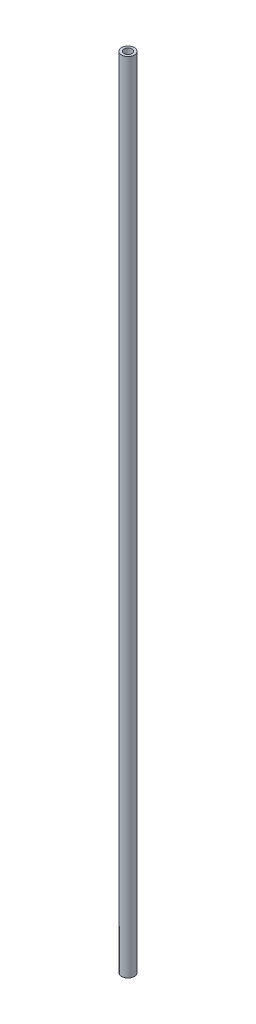
ISO-10303-21;
HEADER;
FILE_DESCRIPTION(('STEP AP214'),'2;1');
FILE_NAME('part.step','',(''),(''),'','','');
FILE_SCHEMA(('AUTOMOTIVE_DESIGN { 1 0 10303 214 1 1 1 1 }'));
ENDSEC;
DATA;
#1=APPLICATION_CONTEXT('core data for automotive mechanical design processes');
#2=APPLICATION_PROTOCOL_DEFINITION('international standard','automotive_design',2000,#1);
#3=PRODUCT_CONTEXT('',#1,'mechanical');
#4=PRODUCT('Part','Part','',(#3));
#5=PRODUCT_RELATED_PRODUCT_CATEGORY('part','',(#4));
#6=PRODUCT_DEFINITION_FORMATION('','',#4);
#7=PRODUCT_DEFINITION_CONTEXT('part definition',#1,'design');
#8=PRODUCT_DEFINITION('design','',#6,#7);
#9=PRODUCT_DEFINITION_SHAPE('','',#8);
#10=(LENGTH_UNIT() NAMED_UNIT(*) SI_UNIT(.MILLI.,.METRE.));
#11=(NAMED_UNIT(*) PLANE_ANGLE_UNIT() SI_UNIT($,.RADIAN.));
#12=(NAMED_UNIT(*) SI_UNIT($,.STERADIAN.) SOLID_ANGLE_UNIT());
#13=UNCERTAINTY_MEASURE_WITH_UNIT(LENGTH_MEASURE(1.E-05),#10,'distance_accuracy_value','');
#14=(GEOMETRIC_REPRESENTATION_CONTEXT(3) GLOBAL_UNCERTAINTY_ASSIGNED_CONTEXT((#13)) GLOBAL_UNIT_ASSIGNED_CONTEXT((#10,
#11,#12)) REPRESENTATION_CONTEXT('',''));
#15=CARTESIAN_POINT('',(0.,0.,0.));
#16=DIRECTION('',(0.,0.,1.));
#17=DIRECTION('',(1.,0.,0.));
#18=AXIS2_PLACEMENT_3D('',#15,#16,#17);
#19=CARTESIAN_POINT('',(0.,495.,0.));
#20=DIRECTION('',(0.,1.,0.));
#21=DIRECTION('',(0.,0.,1.));
#22=AXIS2_PLACEMENT_3D('',#19,#20,#21);
#23=PLANE('',#22);
#24=CARTESIAN_POINT('',(0.,495.,0.));
#25=DIRECTION('',(0.,1.,0.));
#26=DIRECTION('',(0.,0.,1.));
#27=AXIS2_PLACEMENT_3D('',#24,#25,#26);
#28=CIRCLE('',#27,4.);
#29=CARTESIAN_POINT('',(0.,495.,4.));
#30=VERTEX_POINT('',#29);
#31=EDGE_CURVE('E10',#30,#30,#28,.T.);
#32=ORIENTED_EDGE('',*,*,#31,.T.);
#33=EDGE_LOOP('',(#32));
#34=FACE_BOUND('',#33,.T.);
#35=CARTESIAN_POINT('',(0.,495.,0.));
#36=DIRECTION('',(0.,1.,0.));
#37=DIRECTION('',(0.,0.,1.));
#38=AXIS2_PLACEMENT_3D('',#35,#36,#37);
#39=CIRCLE('',#38,2.5);
#40=CARTESIAN_POINT('',(0.,495.,2.5));
#41=VERTEX_POINT('',#40);
#42=EDGE_CURVE('E44',#41,#41,#39,.T.);
#43=ORIENTED_EDGE('',*,*,#42,.F.);
#44=EDGE_LOOP('',(#43));
#45=FACE_BOUND('',#44,.T.);
#46=ADVANCED_FACE('F33',(#34,#45),#23,.T.);
#47=CARTESIAN_POINT('',(0.,0.,0.));
#48=DIRECTION('',(0.,1.,0.));
#49=DIRECTION('',(0.,0.,1.));
#50=AXIS2_PLACEMENT_3D('',#47,#48,#49);
#51=PLANE('',#50);
#52=CARTESIAN_POINT('',(0.,0.,0.));
#53=DIRECTION('',(0.,1.,0.));
#54=DIRECTION('',(0.,0.,1.));
#55=AXIS2_PLACEMENT_3D('',#52,#53,#54);
#56=CIRCLE('',#55,4.);
#57=CARTESIAN_POINT('',(0.,0.,4.));
#58=VERTEX_POINT('',#57);
#59=EDGE_CURVE('E37',#58,#58,#56,.T.);
#60=ORIENTED_EDGE('',*,*,#59,.F.);
#61=EDGE_LOOP('',(#60));
#62=FACE_BOUND('',#61,.T.);
#63=CARTESIAN_POINT('',(0.,0.,0.));
#64=DIRECTION('',(0.,1.,0.));
#65=DIRECTION('',(0.,0.,1.));
#66=AXIS2_PLACEMENT_3D('',#63,#64,#65);
#67=CIRCLE('',#66,2.5);
#68=CARTESIAN_POINT('',(0.,0.,2.5));
#69=VERTEX_POINT('',#68);
#70=EDGE_CURVE('E46',#69,#69,#67,.T.);
#71=ORIENTED_EDGE('',*,*,#70,.T.);
#72=EDGE_LOOP('',(#71));
#73=FACE_BOUND('',#72,.T.);
#74=ADVANCED_FACE('F56',(#62,#73),#51,.F.);
#75=CARTESIAN_POINT('',(0.,495.,0.));
#76=DIRECTION('',(0.,-1.,0.));
#77=DIRECTION('',(0.,0.,-1.));
#78=AXIS2_PLACEMENT_3D('',#75,#76,#77);
#79=CYLINDRICAL_SURFACE('',#78,4.);
#80=ORIENTED_EDGE('',*,*,#31,.F.);
#81=EDGE_LOOP('',(#80));
#82=FACE_BOUND('',#81,.T.);
#83=ORIENTED_EDGE('',*,*,#59,.T.);
#84=EDGE_LOOP('',(#83));
#85=FACE_BOUND('',#84,.T.);
#86=ADVANCED_FACE('F35',(#82,#85),#79,.T.);
#87=CARTESIAN_POINT('',(0.,495.,0.));
#88=DIRECTION('',(0.,-1.,0.));
#89=DIRECTION('',(0.,0.,-1.));
#90=AXIS2_PLACEMENT_3D('',#87,#88,#89);
#91=CYLINDRICAL_SURFACE('',#90,2.5);
#92=ORIENTED_EDGE('',*,*,#42,.T.);
#93=EDGE_LOOP('',(#92));
#94=FACE_BOUND('',#93,.T.);
#95=ORIENTED_EDGE('',*,*,#70,.F.);
#96=EDGE_LOOP('',(#95));
#97=FACE_BOUND('',#96,.T.);
#98=ADVANCED_FACE('F52',(#94,#97),#91,.F.);
#99=CLOSED_SHELL('',(#46,#74,#86,#98));
#100=MANIFOLD_SOLID_BREP('B2',#99);
#101=ADVANCED_BREP_SHAPE_REPRESENTATION('',(#18,#100),#14);
#102=SHAPE_DEFINITION_REPRESENTATION(#9,#101);
ENDSEC;
END-ISO-10303-21;
